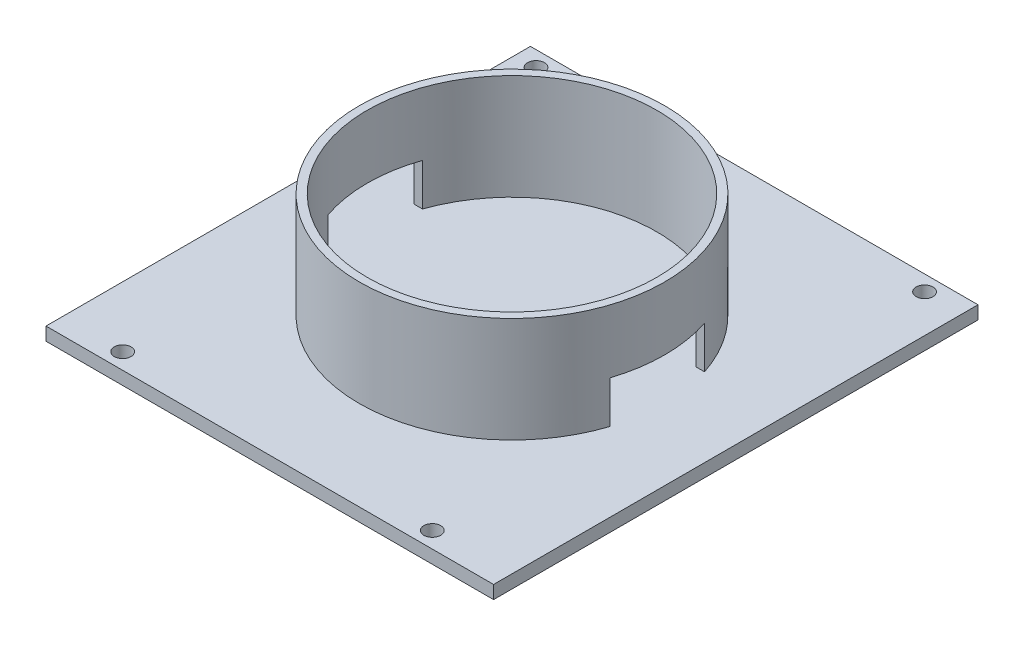
ISO-10303-21;
HEADER;
FILE_DESCRIPTION(('STEP AP214'),'2;1');
FILE_NAME('part.step','',(''),(''),'','','');
FILE_SCHEMA(('AUTOMOTIVE_DESIGN { 1 0 10303 214 1 1 1 1 }'));
ENDSEC;
DATA;
#1=APPLICATION_CONTEXT('core data for automotive mechanical design processes');
#2=APPLICATION_PROTOCOL_DEFINITION('international standard','automotive_design',2000,#1);
#3=PRODUCT_CONTEXT('',#1,'mechanical');
#4=PRODUCT('Part','Part','',(#3));
#5=PRODUCT_RELATED_PRODUCT_CATEGORY('part','',(#4));
#6=PRODUCT_DEFINITION_FORMATION('','',#4);
#7=PRODUCT_DEFINITION_CONTEXT('part definition',#1,'design');
#8=PRODUCT_DEFINITION('design','',#6,#7);
#9=PRODUCT_DEFINITION_SHAPE('','',#8);
#10=(LENGTH_UNIT() NAMED_UNIT(*) SI_UNIT(.MILLI.,.METRE.));
#11=(NAMED_UNIT(*) PLANE_ANGLE_UNIT() SI_UNIT($,.RADIAN.));
#12=(NAMED_UNIT(*) SI_UNIT($,.STERADIAN.) SOLID_ANGLE_UNIT());
#13=UNCERTAINTY_MEASURE_WITH_UNIT(LENGTH_MEASURE(1.E-05),#10,'distance_accuracy_value','');
#14=(GEOMETRIC_REPRESENTATION_CONTEXT(3) GLOBAL_UNCERTAINTY_ASSIGNED_CONTEXT((#13)) GLOBAL_UNIT_ASSIGNED_CONTEXT((#10,
#11,#12)) REPRESENTATION_CONTEXT('',''));
#15=CARTESIAN_POINT('',(0.,0.,0.));
#16=DIRECTION('',(0.,0.,1.));
#17=DIRECTION('',(1.,0.,0.));
#18=AXIS2_PLACEMENT_3D('',#15,#16,#17);
#19=CARTESIAN_POINT('',(-42.5,2.5,-21.3368283093053));
#20=DIRECTION('',(1.,0.,0.));
#21=DIRECTION('',(0.,0.,-1.));
#22=AXIS2_PLACEMENT_3D('',#19,#20,#21);
#23=PLANE('',#22);
#24=DIRECTION('',(0.,0.,1.));
#25=VECTOR('',#24,1.);
#26=CARTESIAN_POINT('',(-42.5,0.,-21.3368283093053));
#27=LINE('',#26,#25);
#28=CARTESIAN_POINT('',(-42.5,0.,-21.3368283093053));
#29=VERTEX_POINT('',#28);
#30=CARTESIAN_POINT('',(-42.5,0.,70.6631716906947));
#31=VERTEX_POINT('',#30);
#32=EDGE_CURVE('E204',#29,#31,#27,.T.);
#33=ORIENTED_EDGE('',*,*,#32,.T.);
#34=DIRECTION('',(0.,-1.,0.));
#35=VECTOR('',#34,1.);
#36=CARTESIAN_POINT('',(-42.5,2.5,70.6631716906947));
#37=LINE('',#36,#35);
#38=CARTESIAN_POINT('',(-42.5,2.5,70.6631716906947));
#39=VERTEX_POINT('',#38);
#40=EDGE_CURVE('E268',#39,#31,#37,.T.);
#41=ORIENTED_EDGE('',*,*,#40,.F.);
#42=DIRECTION('',(0.,0.,1.));
#43=VECTOR('',#42,1.);
#44=CARTESIAN_POINT('',(-42.5,2.5,-21.3368283093053));
#45=LINE('',#44,#43);
#46=CARTESIAN_POINT('',(-42.5,2.5,-21.3368283093053));
#47=VERTEX_POINT('',#46);
#48=EDGE_CURVE('E232',#47,#39,#45,.T.);
#49=ORIENTED_EDGE('',*,*,#48,.F.);
#50=DIRECTION('',(0.,-1.,0.));
#51=VECTOR('',#50,1.);
#52=CARTESIAN_POINT('',(-42.5,2.5,-21.3368283093053));
#53=LINE('',#52,#51);
#54=EDGE_CURVE('E245',#47,#29,#53,.T.);
#55=ORIENTED_EDGE('',*,*,#54,.T.);
#56=EDGE_LOOP('',(#33,#41,#49,#55));
#57=FACE_BOUND('',#56,.T.);
#58=ADVANCED_FACE('F45',(#57),#23,.F.);
#59=CARTESIAN_POINT('',(32.5,2.5,70.6631716906947));
#60=DIRECTION('',(0.,0.,-1.));
#61=DIRECTION('',(-1.,0.,0.));
#62=AXIS2_PLACEMENT_3D('',#59,#60,#61);
#63=PLANE('',#62);
#64=DIRECTION('',(1.,0.,0.));
#65=VECTOR('',#64,1.);
#66=CARTESIAN_POINT('',(32.5,0.,70.6631716906947));
#67=LINE('',#66,#65);
#68=CARTESIAN_POINT('',(42.5,0.,70.6631716906947));
#69=VERTEX_POINT('',#68);
#70=EDGE_CURVE('E249',#31,#69,#67,.T.);
#71=ORIENTED_EDGE('',*,*,#70,.T.);
#72=DIRECTION('',(0.,-1.,0.));
#73=VECTOR('',#72,1.);
#74=CARTESIAN_POINT('',(42.5,2.5,70.6631716906947));
#75=LINE('',#74,#73);
#76=CARTESIAN_POINT('',(42.5,2.5,70.6631716906947));
#77=VERTEX_POINT('',#76);
#78=EDGE_CURVE('E264',#77,#69,#75,.T.);
#79=ORIENTED_EDGE('',*,*,#78,.F.);
#80=DIRECTION('',(1.,0.,0.));
#81=VECTOR('',#80,1.);
#82=CARTESIAN_POINT('',(-42.5,2.5,70.6631716906947));
#83=LINE('',#82,#81);
#84=EDGE_CURVE('E235',#39,#77,#83,.T.);
#85=ORIENTED_EDGE('',*,*,#84,.F.);
#86=ORIENTED_EDGE('',*,*,#40,.T.);
#87=EDGE_LOOP('',(#71,#79,#85,#86));
#88=FACE_BOUND('',#87,.T.);
#89=ADVANCED_FACE('F308',(#88),#63,.F.);
#90=CARTESIAN_POINT('',(42.5,2.5,70.6631716906947));
#91=DIRECTION('',(-1.,0.,0.));
#92=DIRECTION('',(0.,0.,1.));
#93=AXIS2_PLACEMENT_3D('',#90,#91,#92);
#94=PLANE('',#93);
#95=DIRECTION('',(0.,0.,-1.));
#96=VECTOR('',#95,1.);
#97=CARTESIAN_POINT('',(42.5,0.,70.6631716906947));
#98=LINE('',#97,#96);
#99=CARTESIAN_POINT('',(42.5,0.,-21.3368283093053));
#100=VERTEX_POINT('',#99);
#101=EDGE_CURVE('E252',#69,#100,#98,.T.);
#102=ORIENTED_EDGE('',*,*,#101,.T.);
#103=DIRECTION('',(0.,-1.,0.));
#104=VECTOR('',#103,1.);
#105=CARTESIAN_POINT('',(42.5,2.5,-21.3368283093053));
#106=LINE('',#105,#104);
#107=CARTESIAN_POINT('',(42.5,2.5,-21.3368283093053));
#108=VERTEX_POINT('',#107);
#109=EDGE_CURVE('E260',#108,#100,#106,.T.);
#110=ORIENTED_EDGE('',*,*,#109,.F.);
#111=DIRECTION('',(0.,0.,-1.));
#112=VECTOR('',#111,1.);
#113=CARTESIAN_POINT('',(42.5,2.5,70.6631716906947));
#114=LINE('',#113,#112);
#115=EDGE_CURVE('E239',#77,#108,#114,.T.);
#116=ORIENTED_EDGE('',*,*,#115,.F.);
#117=ORIENTED_EDGE('',*,*,#78,.T.);
#118=EDGE_LOOP('',(#102,#110,#116,#117));
#119=FACE_BOUND('',#118,.T.);
#120=ADVANCED_FACE('F314',(#119),#94,.F.);
#121=CARTESIAN_POINT('',(-42.5,2.5,-21.3368283093053));
#122=DIRECTION('',(0.,0.,1.));
#123=DIRECTION('',(1.,0.,0.));
#124=AXIS2_PLACEMENT_3D('',#121,#122,#123);
#125=PLANE('',#124);
#126=DIRECTION('',(-1.,0.,0.));
#127=VECTOR('',#126,1.);
#128=CARTESIAN_POINT('',(-42.5,0.,-21.3368283093053));
#129=LINE('',#128,#127);
#130=EDGE_CURVE('E236',#100,#29,#129,.T.);
#131=ORIENTED_EDGE('',*,*,#130,.T.);
#132=ORIENTED_EDGE('',*,*,#54,.F.);
#133=DIRECTION('',(-1.,0.,0.));
#134=VECTOR('',#133,1.);
#135=CARTESIAN_POINT('',(-42.5,2.5,-21.3368283093053));
#136=LINE('',#135,#134);
#137=EDGE_CURVE('E242',#108,#47,#136,.T.);
#138=ORIENTED_EDGE('',*,*,#137,.F.);
#139=ORIENTED_EDGE('',*,*,#109,.T.);
#140=EDGE_LOOP('',(#131,#132,#138,#139));
#141=FACE_BOUND('',#140,.T.);
#142=ADVANCED_FACE('F333',(#141),#125,.F.);
#143=CARTESIAN_POINT('',(0.,2.5,0.));
#144=DIRECTION('',(0.,1.,0.));
#145=DIRECTION('',(0.,0.,1.));
#146=AXIS2_PLACEMENT_3D('',#143,#144,#145);
#147=PLANE('',#146);
#148=CARTESIAN_POINT('',(0.,2.5,24.6631716906947));
#149=DIRECTION('',(0.,1.,0.));
#150=DIRECTION('',(0.,0.,1.));
#151=AXIS2_PLACEMENT_3D('',#148,#149,#150);
#152=CIRCLE('',#151,29.);
#153=CARTESIAN_POINT('',(-27.5680975041804,2.5,33.6631716906947));
#154=VERTEX_POINT('',#153);
#155=CARTESIAN_POINT('',(27.5680975041805,2.5,33.6631716906947));
#156=VERTEX_POINT('',#155);
#157=EDGE_CURVE('E192',#154,#156,#152,.T.);
#158=ORIENTED_EDGE('',*,*,#157,.F.);
#159=DIRECTION('',(1.,0.,0.));
#160=VECTOR('',#159,1.);
#161=CARTESIAN_POINT('',(-42.5,2.5,33.6631716906947));
#162=LINE('',#161,#160);
#163=CARTESIAN_POINT('',(-25.9855729203726,2.5,33.6631716906947));
#164=VERTEX_POINT('',#163);
#165=EDGE_CURVE('E472',#154,#164,#162,.T.);
#166=ORIENTED_EDGE('',*,*,#165,.T.);
#167=CARTESIAN_POINT('',(0.,2.5,24.6631716906947));
#168=DIRECTION('',(0.,1.,0.));
#169=DIRECTION('',(0.,0.,1.));
#170=AXIS2_PLACEMENT_3D('',#167,#168,#169);
#171=CIRCLE('',#170,27.5);
#172=CARTESIAN_POINT('',(25.9855729203726,2.5,33.6631716906947));
#173=VERTEX_POINT('',#172);
#174=EDGE_CURVE('E271',#173,#164,#171,.F.);
#175=ORIENTED_EDGE('',*,*,#174,.F.);
#176=EDGE_CURVE('E68',#173,#156,#162,.T.);
#177=ORIENTED_EDGE('',*,*,#176,.T.);
#178=EDGE_LOOP('',(#158,#166,#175,#177));
#179=FACE_BOUND('',#178,.T.);
#180=CARTESIAN_POINT('',(27.5680975041804,2.5,15.6631716906947));
#181=VERTEX_POINT('',#180);
#182=CARTESIAN_POINT('',(-27.5680975041804,2.5,15.6631716906947));
#183=VERTEX_POINT('',#182);
#184=EDGE_CURVE('E163',#181,#183,#152,.T.);
#185=ORIENTED_EDGE('',*,*,#184,.F.);
#186=DIRECTION('',(1.,0.,0.));
#187=VECTOR('',#186,1.);
#188=CARTESIAN_POINT('',(-42.5,2.5,15.6631716906947));
#189=LINE('',#188,#187);
#190=CARTESIAN_POINT('',(25.9855729203726,2.5,15.6631716906947));
#191=VERTEX_POINT('',#190);
#192=EDGE_CURVE('E469',#191,#181,#189,.T.);
#193=ORIENTED_EDGE('',*,*,#192,.F.);
#194=CARTESIAN_POINT('',(-25.9855729203726,2.5,15.6631716906947));
#195=VERTEX_POINT('',#194);
#196=EDGE_CURVE('E274',#195,#191,#171,.F.);
#197=ORIENTED_EDGE('',*,*,#196,.F.);
#198=EDGE_CURVE('E60',#183,#195,#189,.T.);
#199=ORIENTED_EDGE('',*,*,#198,.F.);
#200=EDGE_LOOP('',(#185,#193,#197,#199));
#201=FACE_BOUND('',#200,.T.);
#202=ORIENTED_EDGE('',*,*,#115,.T.);
#203=ORIENTED_EDGE('',*,*,#137,.T.);
#204=ORIENTED_EDGE('',*,*,#48,.T.);
#205=ORIENTED_EDGE('',*,*,#84,.T.);
#206=EDGE_LOOP('',(#202,#203,#204,#205));
#207=FACE_BOUND('',#206,.T.);
#208=CARTESIAN_POINT('',(-38.5,2.5,-18.3936289008384));
#209=DIRECTION('',(0.,1.,0.));
#210=DIRECTION('',(0.,0.,1.));
#211=AXIS2_PLACEMENT_3D('',#208,#209,#210);
#212=CIRCLE('',#211,1.6);
#213=CARTESIAN_POINT('',(-38.5,2.5,-16.7936289008384));
#214=VERTEX_POINT('',#213);
#215=EDGE_CURVE('E205',#214,#214,#212,.T.);
#216=ORIENTED_EDGE('',*,*,#215,.F.);
#217=EDGE_LOOP('',(#216));
#218=FACE_BOUND('',#217,.T.);
#219=CARTESIAN_POINT('',(35.3,2.5,-18.3936289008384));
#220=DIRECTION('',(0.,1.,0.));
#221=DIRECTION('',(0.,0.,1.));
#222=AXIS2_PLACEMENT_3D('',#219,#220,#221);
#223=CIRCLE('',#222,1.6);
#224=CARTESIAN_POINT('',(35.3,2.5,-16.7936289008384));
#225=VERTEX_POINT('',#224);
#226=EDGE_CURVE('E209',#225,#225,#223,.T.);
#227=ORIENTED_EDGE('',*,*,#226,.F.);
#228=EDGE_LOOP('',(#227));
#229=FACE_BOUND('',#228,.T.);
#230=CARTESIAN_POINT('',(-31.,2.5,67.6063710991616));
#231=DIRECTION('',(0.,1.,0.));
#232=DIRECTION('',(0.,0.,1.));
#233=AXIS2_PLACEMENT_3D('',#230,#231,#232);
#234=CIRCLE('',#233,1.60000000000001);
#235=CARTESIAN_POINT('',(-31.,2.5,69.2063710991616));
#236=VERTEX_POINT('',#235);
#237=EDGE_CURVE('E225',#236,#236,#234,.T.);
#238=ORIENTED_EDGE('',*,*,#237,.F.);
#239=EDGE_LOOP('',(#238));
#240=FACE_BOUND('',#239,.T.);
#241=CARTESIAN_POINT('',(27.8,2.5,67.6063710991616));
#242=DIRECTION('',(0.,1.,0.));
#243=DIRECTION('',(0.,0.,1.));
#244=AXIS2_PLACEMENT_3D('',#241,#242,#243);
#245=CIRCLE('',#244,1.60000000000001);
#246=CARTESIAN_POINT('',(27.8,2.5,69.2063710991616));
#247=VERTEX_POINT('',#246);
#248=EDGE_CURVE('E210',#247,#247,#245,.T.);
#249=ORIENTED_EDGE('',*,*,#248,.F.);
#250=EDGE_LOOP('',(#249));
#251=FACE_BOUND('',#250,.T.);
#252=ADVANCED_FACE('F328',(#179,#201,#207,#218,#229,#240,#251),#147,.T.);
#253=CARTESIAN_POINT('',(0.,0.,0.));
#254=DIRECTION('',(0.,1.,0.));
#255=DIRECTION('',(0.,0.,1.));
#256=AXIS2_PLACEMENT_3D('',#253,#254,#255);
#257=PLANE('',#256);
#258=CARTESIAN_POINT('',(-38.5,0.,-18.3936289008384));
#259=DIRECTION('',(0.,1.,0.));
#260=DIRECTION('',(0.,0.,1.));
#261=AXIS2_PLACEMENT_3D('',#258,#259,#260);
#262=CIRCLE('',#261,1.6);
#263=CARTESIAN_POINT('',(-38.5,0.,-16.7936289008384));
#264=VERTEX_POINT('',#263);
#265=EDGE_CURVE('E200',#264,#264,#262,.T.);
#266=ORIENTED_EDGE('',*,*,#265,.T.);
#267=EDGE_LOOP('',(#266));
#268=FACE_BOUND('',#267,.T.);
#269=CARTESIAN_POINT('',(27.8,0.,67.6063710991616));
#270=DIRECTION('',(0.,1.,0.));
#271=DIRECTION('',(0.,0.,1.));
#272=AXIS2_PLACEMENT_3D('',#269,#270,#271);
#273=CIRCLE('',#272,1.60000000000001);
#274=CARTESIAN_POINT('',(27.8,0.,69.2063710991616));
#275=VERTEX_POINT('',#274);
#276=EDGE_CURVE('E197',#275,#275,#273,.T.);
#277=ORIENTED_EDGE('',*,*,#276,.T.);
#278=EDGE_LOOP('',(#277));
#279=FACE_BOUND('',#278,.T.);
#280=CARTESIAN_POINT('',(-31.,0.,67.6063710991616));
#281=DIRECTION('',(0.,1.,0.));
#282=DIRECTION('',(0.,0.,1.));
#283=AXIS2_PLACEMENT_3D('',#280,#281,#282);
#284=CIRCLE('',#283,1.60000000000001);
#285=CARTESIAN_POINT('',(-31.,0.,69.2063710991616));
#286=VERTEX_POINT('',#285);
#287=EDGE_CURVE('E214',#286,#286,#284,.T.);
#288=ORIENTED_EDGE('',*,*,#287,.T.);
#289=EDGE_LOOP('',(#288));
#290=FACE_BOUND('',#289,.T.);
#291=CARTESIAN_POINT('',(35.3,0.,-18.3936289008384));
#292=DIRECTION('',(0.,1.,0.));
#293=DIRECTION('',(0.,0.,1.));
#294=AXIS2_PLACEMENT_3D('',#291,#292,#293);
#295=CIRCLE('',#294,1.6);
#296=CARTESIAN_POINT('',(35.3,0.,-16.7936289008384));
#297=VERTEX_POINT('',#296);
#298=EDGE_CURVE('E221',#297,#297,#295,.T.);
#299=ORIENTED_EDGE('',*,*,#298,.T.);
#300=EDGE_LOOP('',(#299));
#301=FACE_BOUND('',#300,.T.);
#302=ORIENTED_EDGE('',*,*,#32,.F.);
#303=ORIENTED_EDGE('',*,*,#130,.F.);
#304=ORIENTED_EDGE('',*,*,#101,.F.);
#305=ORIENTED_EDGE('',*,*,#70,.F.);
#306=EDGE_LOOP('',(#302,#303,#304,#305));
#307=FACE_BOUND('',#306,.T.);
#308=ADVANCED_FACE('F322',(#268,#279,#290,#301,#307),#257,.F.);
#309=CARTESIAN_POINT('',(35.3,0.,-18.3936289008384));
#310=DIRECTION('',(0.,1.,0.));
#311=DIRECTION('',(0.,0.,1.));
#312=AXIS2_PLACEMENT_3D('',#309,#310,#311);
#313=CYLINDRICAL_SURFACE('',#312,1.6);
#314=ORIENTED_EDGE('',*,*,#298,.F.);
#315=EDGE_LOOP('',(#314));
#316=FACE_BOUND('',#315,.T.);
#317=ORIENTED_EDGE('',*,*,#226,.T.);
#318=EDGE_LOOP('',(#317));
#319=FACE_BOUND('',#318,.T.);
#320=ADVANCED_FACE('F344',(#316,#319),#313,.F.);
#321=CARTESIAN_POINT('',(-31.,0.,67.6063710991616));
#322=DIRECTION('',(0.,1.,0.));
#323=DIRECTION('',(0.,0.,1.));
#324=AXIS2_PLACEMENT_3D('',#321,#322,#323);
#325=CYLINDRICAL_SURFACE('',#324,1.60000000000001);
#326=ORIENTED_EDGE('',*,*,#287,.F.);
#327=EDGE_LOOP('',(#326));
#328=FACE_BOUND('',#327,.T.);
#329=ORIENTED_EDGE('',*,*,#237,.T.);
#330=EDGE_LOOP('',(#329));
#331=FACE_BOUND('',#330,.T.);
#332=ADVANCED_FACE('F347',(#328,#331),#325,.F.);
#333=CARTESIAN_POINT('',(27.8,0.,67.6063710991616));
#334=DIRECTION('',(0.,1.,0.));
#335=DIRECTION('',(0.,0.,1.));
#336=AXIS2_PLACEMENT_3D('',#333,#334,#335);
#337=CYLINDRICAL_SURFACE('',#336,1.60000000000001);
#338=ORIENTED_EDGE('',*,*,#276,.F.);
#339=EDGE_LOOP('',(#338));
#340=FACE_BOUND('',#339,.T.);
#341=ORIENTED_EDGE('',*,*,#248,.T.);
#342=EDGE_LOOP('',(#341));
#343=FACE_BOUND('',#342,.T.);
#344=ADVANCED_FACE('F305',(#340,#343),#337,.F.);
#345=CARTESIAN_POINT('',(-38.5,0.,-18.3936289008384));
#346=DIRECTION('',(0.,1.,0.));
#347=DIRECTION('',(0.,0.,1.));
#348=AXIS2_PLACEMENT_3D('',#345,#346,#347);
#349=CYLINDRICAL_SURFACE('',#348,1.6);
#350=ORIENTED_EDGE('',*,*,#265,.F.);
#351=EDGE_LOOP('',(#350));
#352=FACE_BOUND('',#351,.T.);
#353=ORIENTED_EDGE('',*,*,#215,.T.);
#354=EDGE_LOOP('',(#353));
#355=FACE_BOUND('',#354,.T.);
#356=ADVANCED_FACE('F295',(#352,#355),#349,.F.);
#357=CARTESIAN_POINT('',(0.,22.5,24.6631716906947));
#358=DIRECTION('',(0.,1.,0.));
#359=DIRECTION('',(0.,0.,1.));
#360=AXIS2_PLACEMENT_3D('',#357,#358,#359);
#361=PLANE('',#360);
#362=CARTESIAN_POINT('',(0.,22.5,24.6631716906947));
#363=DIRECTION('',(0.,1.,0.));
#364=DIRECTION('',(0.,0.,1.));
#365=AXIS2_PLACEMENT_3D('',#362,#363,#364);
#366=CIRCLE('',#365,29.);
#367=CARTESIAN_POINT('',(0.,22.5,53.6631716906947));
#368=VERTEX_POINT('',#367);
#369=EDGE_CURVE('E193',#368,#368,#366,.T.);
#370=ORIENTED_EDGE('',*,*,#369,.T.);
#371=EDGE_LOOP('',(#370));
#372=FACE_BOUND('',#371,.T.);
#373=CARTESIAN_POINT('',(0.,22.5,24.6631716906947));
#374=DIRECTION('',(0.,1.,0.));
#375=DIRECTION('',(0.,0.,1.));
#376=AXIS2_PLACEMENT_3D('',#373,#374,#375);
#377=CIRCLE('',#376,27.5);
#378=CARTESIAN_POINT('',(0.,22.5,52.1631716906947));
#379=VERTEX_POINT('',#378);
#380=EDGE_CURVE('E188',#379,#379,#377,.T.);
#381=ORIENTED_EDGE('',*,*,#380,.F.);
#382=EDGE_LOOP('',(#381));
#383=FACE_BOUND('',#382,.T.);
#384=ADVANCED_FACE('F293',(#372,#383),#361,.T.);
#385=CARTESIAN_POINT('',(0.,22.5,24.6631716906947));
#386=DIRECTION('',(0.,-1.,0.));
#387=DIRECTION('',(0.,0.,-1.));
#388=AXIS2_PLACEMENT_3D('',#385,#386,#387);
#389=CYLINDRICAL_SURFACE('',#388,29.);
#390=ORIENTED_EDGE('',*,*,#369,.F.);
#391=EDGE_LOOP('',(#390));
#392=FACE_BOUND('',#391,.T.);
#393=ORIENTED_EDGE('',*,*,#157,.T.);
#394=DIRECTION('',(0.,-1.,0.));
#395=VECTOR('',#394,1.);
#396=CARTESIAN_POINT('',(27.5680975041804,22.5,33.6631716906947));
#397=LINE('',#396,#395);
#398=CARTESIAN_POINT('',(27.5680975041804,10.5,33.6631716906947));
#399=VERTEX_POINT('',#398);
#400=EDGE_CURVE('E182',#156,#399,#397,.F.);
#401=ORIENTED_EDGE('',*,*,#400,.T.);
#402=CARTESIAN_POINT('',(0.,10.5,24.6631716906947));
#403=DIRECTION('',(0.,1.,0.));
#404=DIRECTION('',(0.,0.,1.));
#405=AXIS2_PLACEMENT_3D('',#402,#403,#404);
#406=CIRCLE('',#405,29.);
#407=CARTESIAN_POINT('',(27.5680975041804,10.5,15.6631716906947));
#408=VERTEX_POINT('',#407);
#409=EDGE_CURVE('E147',#399,#408,#406,.T.);
#410=ORIENTED_EDGE('',*,*,#409,.T.);
#411=DIRECTION('',(0.,-1.,0.));
#412=VECTOR('',#411,1.);
#413=CARTESIAN_POINT('',(27.5680975041804,22.5,15.6631716906947));
#414=LINE('',#413,#412);
#415=EDGE_CURVE('E165',#408,#181,#414,.T.);
#416=ORIENTED_EDGE('',*,*,#415,.T.);
#417=ORIENTED_EDGE('',*,*,#184,.T.);
#418=DIRECTION('',(0.,-1.,0.));
#419=VECTOR('',#418,1.);
#420=CARTESIAN_POINT('',(-27.5680975041804,22.5,15.6631716906947));
#421=LINE('',#420,#419);
#422=CARTESIAN_POINT('',(-27.5680975041804,10.5,15.6631716906947));
#423=VERTEX_POINT('',#422);
#424=EDGE_CURVE('E152',#183,#423,#421,.F.);
#425=ORIENTED_EDGE('',*,*,#424,.T.);
#426=CARTESIAN_POINT('',(-27.5680975041804,10.5,33.6631716906947));
#427=VERTEX_POINT('',#426);
#428=EDGE_CURVE('E136',#423,#427,#406,.T.);
#429=ORIENTED_EDGE('',*,*,#428,.T.);
#430=DIRECTION('',(0.,-1.,0.));
#431=VECTOR('',#430,1.);
#432=CARTESIAN_POINT('',(-27.5680975041804,22.5,33.6631716906947));
#433=LINE('',#432,#431);
#434=EDGE_CURVE('E148',#427,#154,#433,.T.);
#435=ORIENTED_EDGE('',*,*,#434,.T.);
#436=EDGE_LOOP('',(#393,#401,#410,#416,#417,#425,#429,#435));
#437=FACE_BOUND('',#436,.T.);
#438=ADVANCED_FACE('F161',(#392,#437),#389,.T.);
#439=CARTESIAN_POINT('',(0.,22.5,24.6631716906947));
#440=DIRECTION('',(0.,-1.,0.));
#441=DIRECTION('',(0.,0.,-1.));
#442=AXIS2_PLACEMENT_3D('',#439,#440,#441);
#443=CYLINDRICAL_SURFACE('',#442,27.5);
#444=DIRECTION('',(0.,-1.,0.));
#445=VECTOR('',#444,1.);
#446=CARTESIAN_POINT('',(25.9855729203726,22.5,33.6631716906947));
#447=LINE('',#446,#445);
#448=CARTESIAN_POINT('',(25.9855729203726,10.5,33.6631716906947));
#449=VERTEX_POINT('',#448);
#450=EDGE_CURVE('E170',#173,#449,#447,.F.);
#451=ORIENTED_EDGE('',*,*,#450,.F.);
#452=ORIENTED_EDGE('',*,*,#174,.T.);
#453=DIRECTION('',(0.,-1.,0.));
#454=VECTOR('',#453,1.);
#455=CARTESIAN_POINT('',(-25.9855729203726,22.5,33.6631716906947));
#456=LINE('',#455,#454);
#457=CARTESIAN_POINT('',(-25.9855729203726,10.5,33.6631716906947));
#458=VERTEX_POINT('',#457);
#459=EDGE_CURVE('E178',#458,#164,#456,.T.);
#460=ORIENTED_EDGE('',*,*,#459,.F.);
#461=CARTESIAN_POINT('',(0.,10.5,24.6631716906947));
#462=DIRECTION('',(0.,1.,0.));
#463=DIRECTION('',(0.,0.,1.));
#464=AXIS2_PLACEMENT_3D('',#461,#462,#463);
#465=CIRCLE('',#464,27.5);
#466=CARTESIAN_POINT('',(-25.9855729203726,10.5,15.6631716906947));
#467=VERTEX_POINT('',#466);
#468=EDGE_CURVE('E48',#467,#458,#465,.T.);
#469=ORIENTED_EDGE('',*,*,#468,.F.);
#470=DIRECTION('',(0.,-1.,0.));
#471=VECTOR('',#470,1.);
#472=CARTESIAN_POINT('',(-25.9855729203726,22.5,15.6631716906947));
#473=LINE('',#472,#471);
#474=EDGE_CURVE('E155',#195,#467,#473,.F.);
#475=ORIENTED_EDGE('',*,*,#474,.F.);
#476=ORIENTED_EDGE('',*,*,#196,.T.);
#477=DIRECTION('',(0.,-1.,0.));
#478=VECTOR('',#477,1.);
#479=CARTESIAN_POINT('',(25.9855729203726,22.5,15.6631716906947));
#480=LINE('',#479,#478);
#481=CARTESIAN_POINT('',(25.9855729203726,10.5,15.6631716906947));
#482=VERTEX_POINT('',#481);
#483=EDGE_CURVE('E166',#482,#191,#480,.T.);
#484=ORIENTED_EDGE('',*,*,#483,.F.);
#485=EDGE_CURVE('E11',#449,#482,#465,.T.);
#486=ORIENTED_EDGE('',*,*,#485,.F.);
#487=EDGE_LOOP('',(#451,#452,#460,#469,#475,#476,#484,#486));
#488=FACE_BOUND('',#487,.T.);
#489=ORIENTED_EDGE('',*,*,#380,.T.);
#490=EDGE_LOOP('',(#489));
#491=FACE_BOUND('',#490,.T.);
#492=ADVANCED_FACE('F286',(#488,#491),#443,.F.);
#493=CARTESIAN_POINT('',(-42.5,2.5,15.6631716906947));
#494=DIRECTION('',(0.,0.,-1.));
#495=DIRECTION('',(-1.,0.,0.));
#496=AXIS2_PLACEMENT_3D('',#493,#494,#495);
#497=PLANE('',#496);
#498=ORIENTED_EDGE('',*,*,#198,.T.);
#499=ORIENTED_EDGE('',*,*,#474,.T.);
#500=DIRECTION('',(1.,0.,0.));
#501=VECTOR('',#500,1.);
#502=CARTESIAN_POINT('',(-42.5,10.5,15.6631716906947));
#503=LINE('',#502,#501);
#504=EDGE_CURVE('E139',#423,#467,#503,.T.);
#505=ORIENTED_EDGE('',*,*,#504,.F.);
#506=ORIENTED_EDGE('',*,*,#424,.F.);
#507=EDGE_LOOP('',(#498,#499,#505,#506));
#508=FACE_BOUND('',#507,.T.);
#509=ADVANCED_FACE('F151',(#508),#497,.F.);
#510=CARTESIAN_POINT('',(-42.5,10.5,33.6631716906947));
#511=DIRECTION('',(0.,1.,0.));
#512=DIRECTION('',(0.,0.,1.));
#513=AXIS2_PLACEMENT_3D('',#510,#511,#512);
#514=PLANE('',#513);
#515=ORIENTED_EDGE('',*,*,#504,.T.);
#516=ORIENTED_EDGE('',*,*,#468,.T.);
#517=DIRECTION('',(1.,0.,0.));
#518=VECTOR('',#517,1.);
#519=CARTESIAN_POINT('',(-42.5,10.5,33.6631716906947));
#520=LINE('',#519,#518);
#521=EDGE_CURVE('E142',#427,#458,#520,.T.);
#522=ORIENTED_EDGE('',*,*,#521,.F.);
#523=ORIENTED_EDGE('',*,*,#428,.F.);
#524=EDGE_LOOP('',(#515,#516,#522,#523));
#525=FACE_BOUND('',#524,.T.);
#526=ADVANCED_FACE('F138',(#525),#514,.F.);
#527=CARTESIAN_POINT('',(-42.5,2.5,33.6631716906947));
#528=DIRECTION('',(0.,0.,1.));
#529=DIRECTION('',(1.,0.,0.));
#530=AXIS2_PLACEMENT_3D('',#527,#528,#529);
#531=PLANE('',#530);
#532=ORIENTED_EDGE('',*,*,#521,.T.);
#533=ORIENTED_EDGE('',*,*,#459,.T.);
#534=ORIENTED_EDGE('',*,*,#165,.F.);
#535=ORIENTED_EDGE('',*,*,#434,.F.);
#536=EDGE_LOOP('',(#532,#533,#534,#535));
#537=FACE_BOUND('',#536,.T.);
#538=ADVANCED_FACE('F283',(#537),#531,.F.);
#539=EDGE_CURVE('E157',#449,#399,#520,.T.);
#540=ORIENTED_EDGE('',*,*,#539,.F.);
#541=ORIENTED_EDGE('',*,*,#485,.T.);
#542=EDGE_CURVE('E158',#482,#408,#503,.T.);
#543=ORIENTED_EDGE('',*,*,#542,.T.);
#544=ORIENTED_EDGE('',*,*,#409,.F.);
#545=EDGE_LOOP('',(#540,#541,#543,#544));
#546=FACE_BOUND('',#545,.T.);
#547=ADVANCED_FACE('F426',(#546),#514,.F.);
#548=ORIENTED_EDGE('',*,*,#176,.F.);
#549=ORIENTED_EDGE('',*,*,#450,.T.);
#550=ORIENTED_EDGE('',*,*,#539,.T.);
#551=ORIENTED_EDGE('',*,*,#400,.F.);
#552=EDGE_LOOP('',(#548,#549,#550,#551));
#553=FACE_BOUND('',#552,.T.);
#554=ADVANCED_FACE('F435',(#553),#531,.F.);
#555=ORIENTED_EDGE('',*,*,#542,.F.);
#556=ORIENTED_EDGE('',*,*,#483,.T.);
#557=ORIENTED_EDGE('',*,*,#192,.T.);
#558=ORIENTED_EDGE('',*,*,#415,.F.);
#559=EDGE_LOOP('',(#555,#556,#557,#558));
#560=FACE_BOUND('',#559,.T.);
#561=ADVANCED_FACE('F417',(#560),#497,.F.);
#562=CLOSED_SHELL('',(#58,#89,#120,#142,#252,#308,#320,#332,#344,#356,#384,#438,#492,#509,#526,
#538,#547,#554,#561));
#563=MANIFOLD_SOLID_BREP('B2',#562);
#564=ADVANCED_BREP_SHAPE_REPRESENTATION('',(#18,#563),#14);
#565=SHAPE_DEFINITION_REPRESENTATION(#9,#564);
ENDSEC;
END-ISO-10303-21;
